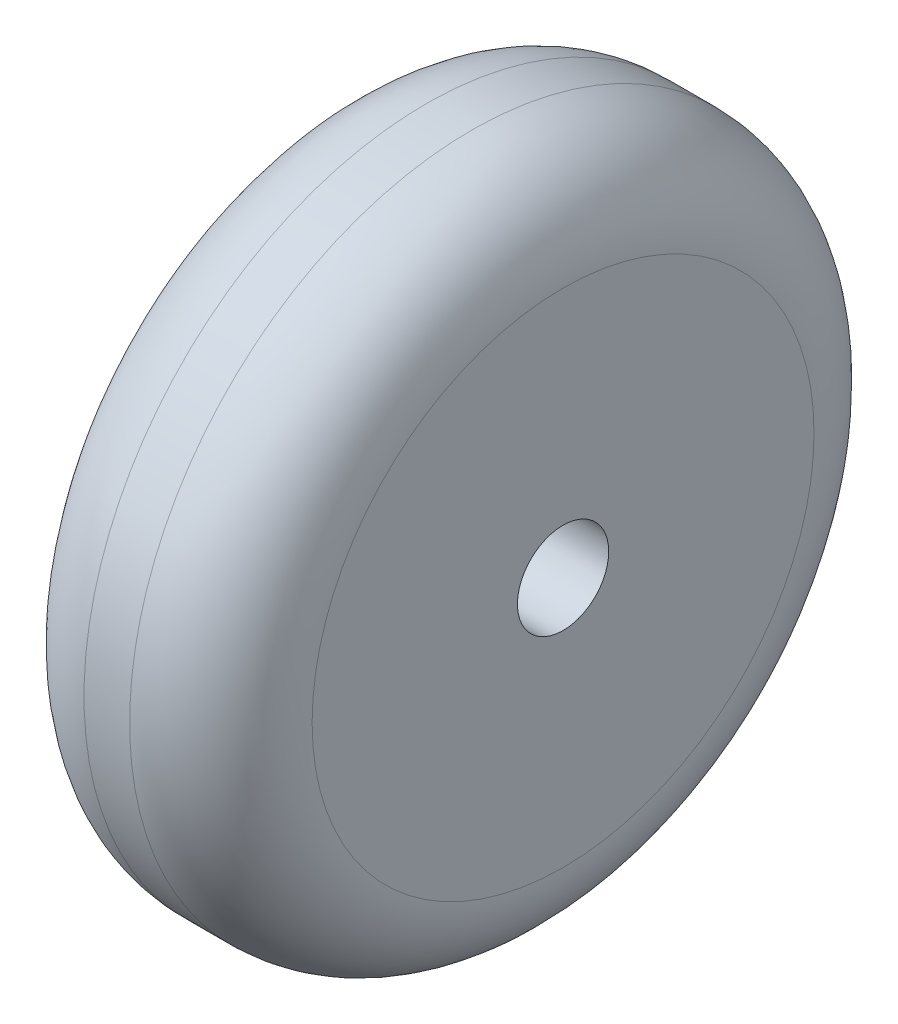
ISO-10303-21;
HEADER;
FILE_DESCRIPTION(('STEP AP214'),'2;1');
FILE_NAME('part.step','',(''),(''),'','','');
FILE_SCHEMA(('AUTOMOTIVE_DESIGN { 1 0 10303 214 1 1 1 1 }'));
ENDSEC;
DATA;
#1=APPLICATION_CONTEXT('core data for automotive mechanical design processes');
#2=APPLICATION_PROTOCOL_DEFINITION('international standard','automotive_design',2000,#1);
#3=PRODUCT_CONTEXT('',#1,'mechanical');
#4=PRODUCT('Part','Part','',(#3));
#5=PRODUCT_RELATED_PRODUCT_CATEGORY('part','',(#4));
#6=PRODUCT_DEFINITION_FORMATION('','',#4);
#7=PRODUCT_DEFINITION_CONTEXT('part definition',#1,'design');
#8=PRODUCT_DEFINITION('design','',#6,#7);
#9=PRODUCT_DEFINITION_SHAPE('','',#8);
#10=(LENGTH_UNIT() NAMED_UNIT(*) SI_UNIT(.MILLI.,.METRE.));
#11=(NAMED_UNIT(*) PLANE_ANGLE_UNIT() SI_UNIT($,.RADIAN.));
#12=(NAMED_UNIT(*) SI_UNIT($,.STERADIAN.) SOLID_ANGLE_UNIT());
#13=UNCERTAINTY_MEASURE_WITH_UNIT(LENGTH_MEASURE(1.E-05),#10,'distance_accuracy_value','');
#14=(GEOMETRIC_REPRESENTATION_CONTEXT(3) GLOBAL_UNCERTAINTY_ASSIGNED_CONTEXT((#13)) GLOBAL_UNIT_ASSIGNED_CONTEXT((#10,
#11,#12)) REPRESENTATION_CONTEXT('',''));
#15=CARTESIAN_POINT('',(0.,0.,0.));
#16=DIRECTION('',(0.,0.,1.));
#17=DIRECTION('',(1.,0.,0.));
#18=AXIS2_PLACEMENT_3D('',#15,#16,#17);
#19=CARTESIAN_POINT('',(0.,0.,0.));
#20=DIRECTION('',(-1.,0.,0.));
#21=DIRECTION('',(0.,0.,1.));
#22=AXIS2_PLACEMENT_3D('',#19,#20,#21);
#23=CYLINDRICAL_SURFACE('',#22,7.5);
#24=CARTESIAN_POINT('',(-3.,0.,0.));
#25=DIRECTION('',(1.,0.,0.));
#26=DIRECTION('',(0.,0.,-1.));
#27=AXIS2_PLACEMENT_3D('',#24,#25,#26);
#28=CIRCLE('',#27,7.5);
#29=CARTESIAN_POINT('',(-2.99999999999999,0.,-7.5));
#30=VERTEX_POINT('',#29);
#31=EDGE_CURVE('E26',#30,#30,#28,.T.);
#32=ORIENTED_EDGE('',*,*,#31,.T.);
#33=EDGE_LOOP('',(#32));
#34=FACE_BOUND('',#33,.T.);
#35=CARTESIAN_POINT('',(-2.,0.,0.));
#36=DIRECTION('',(1.,0.,0.));
#37=DIRECTION('',(0.,0.,-1.));
#38=AXIS2_PLACEMENT_3D('',#35,#36,#37);
#39=CIRCLE('',#38,7.5);
#40=CARTESIAN_POINT('',(-1.99999999999999,0.,-7.5));
#41=VERTEX_POINT('',#40);
#42=EDGE_CURVE('E31',#41,#41,#39,.F.);
#43=ORIENTED_EDGE('',*,*,#42,.T.);
#44=EDGE_LOOP('',(#43));
#45=FACE_BOUND('',#44,.T.);
#46=ADVANCED_FACE('F14',(#34,#45),#23,.T.);
#47=CARTESIAN_POINT('',(0.,0.,0.));
#48=DIRECTION('',(1.,0.,0.));
#49=DIRECTION('',(0.,0.,-1.));
#50=AXIS2_PLACEMENT_3D('',#47,#48,#49);
#51=PLANE('',#50);
#52=CARTESIAN_POINT('',(0.,0.,0.));
#53=DIRECTION('',(1.,0.,0.));
#54=DIRECTION('',(0.,0.,-1.));
#55=AXIS2_PLACEMENT_3D('',#52,#53,#54);
#56=CIRCLE('',#55,1.);
#57=CARTESIAN_POINT('',(0.,0.,-1.));
#58=VERTEX_POINT('',#57);
#59=EDGE_CURVE('E34',#58,#58,#56,.F.);
#60=ORIENTED_EDGE('',*,*,#59,.T.);
#61=EDGE_LOOP('',(#60));
#62=FACE_BOUND('',#61,.T.);
#63=CARTESIAN_POINT('',(0.,0.,0.));
#64=DIRECTION('',(1.,0.,0.));
#65=DIRECTION('',(0.,0.,-1.));
#66=AXIS2_PLACEMENT_3D('',#63,#64,#65);
#67=CIRCLE('',#66,5.5);
#68=CARTESIAN_POINT('',(0.,0.,-5.5));
#69=VERTEX_POINT('',#68);
#70=EDGE_CURVE('E10',#69,#69,#67,.T.);
#71=ORIENTED_EDGE('',*,*,#70,.T.);
#72=EDGE_LOOP('',(#71));
#73=FACE_BOUND('',#72,.T.);
#74=ADVANCED_FACE('F47',(#62,#73),#51,.T.);
#75=CARTESIAN_POINT('',(-5.,0.,0.));
#76=DIRECTION('',(1.,0.,0.));
#77=DIRECTION('',(0.,0.,-1.));
#78=AXIS2_PLACEMENT_3D('',#75,#76,#77);
#79=PLANE('',#78);
#80=CARTESIAN_POINT('',(-5.,0.,0.));
#81=DIRECTION('',(1.,0.,0.));
#82=DIRECTION('',(0.,0.,-1.));
#83=AXIS2_PLACEMENT_3D('',#80,#81,#82);
#84=CIRCLE('',#83,1.);
#85=CARTESIAN_POINT('',(-5.,0.,-1.));
#86=VERTEX_POINT('',#85);
#87=EDGE_CURVE('E18',#86,#86,#84,.F.);
#88=ORIENTED_EDGE('',*,*,#87,.F.);
#89=EDGE_LOOP('',(#88));
#90=FACE_BOUND('',#89,.T.);
#91=CARTESIAN_POINT('',(-5.,0.,0.));
#92=DIRECTION('',(1.,0.,0.));
#93=DIRECTION('',(0.,0.,-1.));
#94=AXIS2_PLACEMENT_3D('',#91,#92,#93);
#95=CIRCLE('',#94,5.5);
#96=CARTESIAN_POINT('',(-4.99999999999999,0.,-5.5));
#97=VERTEX_POINT('',#96);
#98=EDGE_CURVE('E22',#97,#97,#95,.F.);
#99=ORIENTED_EDGE('',*,*,#98,.T.);
#100=EDGE_LOOP('',(#99));
#101=FACE_BOUND('',#100,.T.);
#102=ADVANCED_FACE('F43',(#90,#101),#79,.F.);
#103=CARTESIAN_POINT('',(-3.,0.,0.));
#104=DIRECTION('',(1.,0.,0.));
#105=DIRECTION('',(0.,0.,-1.));
#106=AXIS2_PLACEMENT_3D('',#103,#104,#105);
#107=TOROIDAL_SURFACE('',#106,5.5,2.);
#108=ORIENTED_EDGE('',*,*,#98,.F.);
#109=EDGE_LOOP('',(#108));
#110=FACE_BOUND('',#109,.T.);
#111=ORIENTED_EDGE('',*,*,#31,.F.);
#112=EDGE_LOOP('',(#111));
#113=FACE_BOUND('',#112,.T.);
#114=ADVANCED_FACE('F46',(#110,#113),#107,.T.);
#115=CARTESIAN_POINT('',(-2.,0.,0.));
#116=DIRECTION('',(1.,0.,0.));
#117=DIRECTION('',(0.,0.,-1.));
#118=AXIS2_PLACEMENT_3D('',#115,#116,#117);
#119=TOROIDAL_SURFACE('',#118,5.5,2.);
#120=ORIENTED_EDGE('',*,*,#42,.F.);
#121=EDGE_LOOP('',(#120));
#122=FACE_BOUND('',#121,.T.);
#123=ORIENTED_EDGE('',*,*,#70,.F.);
#124=EDGE_LOOP('',(#123));
#125=FACE_BOUND('',#124,.T.);
#126=ADVANCED_FACE('F16',(#122,#125),#119,.T.);
#127=CARTESIAN_POINT('',(4.,0.,0.));
#128=DIRECTION('',(-1.,0.,0.));
#129=DIRECTION('',(0.,0.,1.));
#130=AXIS2_PLACEMENT_3D('',#127,#128,#129);
#131=CYLINDRICAL_SURFACE('',#130,1.);
#132=ORIENTED_EDGE('',*,*,#59,.F.);
#133=EDGE_LOOP('',(#132));
#134=FACE_BOUND('',#133,.T.);
#135=ORIENTED_EDGE('',*,*,#87,.T.);
#136=EDGE_LOOP('',(#135));
#137=FACE_BOUND('',#136,.T.);
#138=ADVANCED_FACE('F41',(#134,#137),#131,.F.);
#139=CLOSED_SHELL('',(#46,#74,#102,#114,#126,#138));
#140=MANIFOLD_SOLID_BREP('B1',#139);
#141=ADVANCED_BREP_SHAPE_REPRESENTATION('',(#18,#140),#14);
#142=SHAPE_DEFINITION_REPRESENTATION(#9,#141);
ENDSEC;
END-ISO-10303-21;
